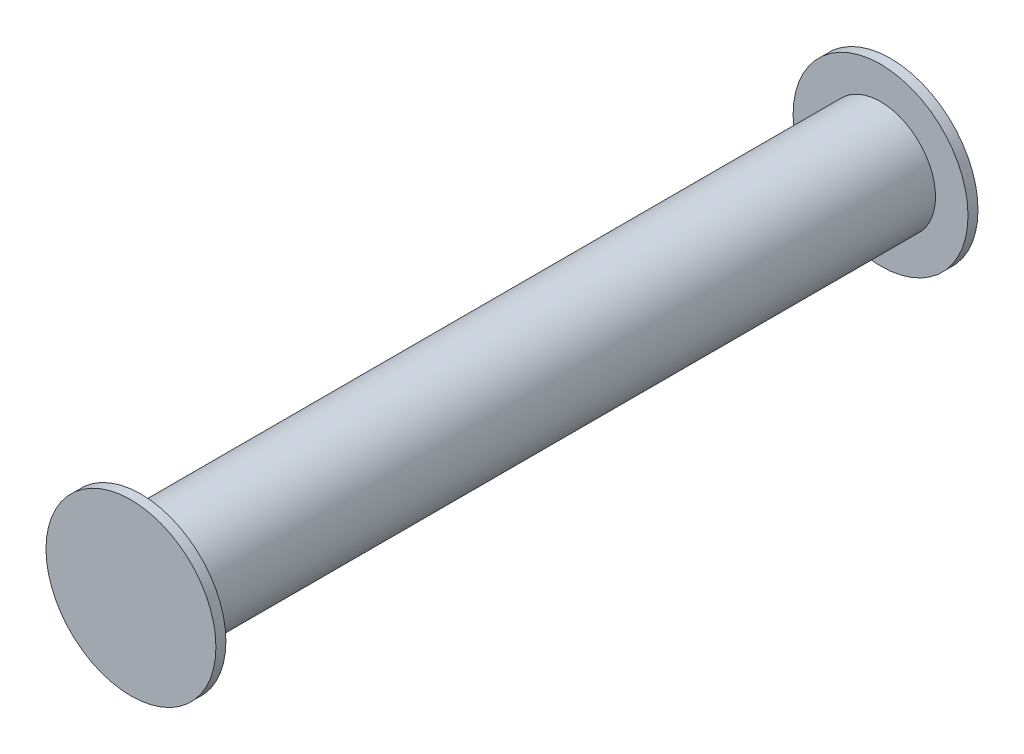
ISO-10303-21;
HEADER;
FILE_DESCRIPTION(('STEP AP214'),'2;1');
FILE_NAME('part.step','',(''),(''),'','','');
FILE_SCHEMA(('AUTOMOTIVE_DESIGN { 1 0 10303 214 1 1 1 1 }'));
ENDSEC;
DATA;
#1=APPLICATION_CONTEXT('core data for automotive mechanical design processes');
#2=APPLICATION_PROTOCOL_DEFINITION('international standard','automotive_design',2000,#1);
#3=PRODUCT_CONTEXT('',#1,'mechanical');
#4=PRODUCT('Part','Part','',(#3));
#5=PRODUCT_RELATED_PRODUCT_CATEGORY('part','',(#4));
#6=PRODUCT_DEFINITION_FORMATION('','',#4);
#7=PRODUCT_DEFINITION_CONTEXT('part definition',#1,'design');
#8=PRODUCT_DEFINITION('design','',#6,#7);
#9=PRODUCT_DEFINITION_SHAPE('','',#8);
#10=(LENGTH_UNIT() NAMED_UNIT(*) SI_UNIT(.MILLI.,.METRE.));
#11=(NAMED_UNIT(*) PLANE_ANGLE_UNIT() SI_UNIT($,.RADIAN.));
#12=(NAMED_UNIT(*) SI_UNIT($,.STERADIAN.) SOLID_ANGLE_UNIT());
#13=UNCERTAINTY_MEASURE_WITH_UNIT(LENGTH_MEASURE(1.E-05),#10,'distance_accuracy_value','');
#14=(GEOMETRIC_REPRESENTATION_CONTEXT(3) GLOBAL_UNCERTAINTY_ASSIGNED_CONTEXT((#13)) GLOBAL_UNIT_ASSIGNED_CONTEXT((#10,
#11,#12)) REPRESENTATION_CONTEXT('',''));
#15=CARTESIAN_POINT('',(0.,0.,0.));
#16=DIRECTION('',(0.,0.,1.));
#17=DIRECTION('',(1.,0.,0.));
#18=AXIS2_PLACEMENT_3D('',#15,#16,#17);
#19=CARTESIAN_POINT('',(0.,0.,152.));
#20=DIRECTION('',(0.,0.,-1.));
#21=DIRECTION('',(-1.,0.,0.));
#22=AXIS2_PLACEMENT_3D('',#19,#20,#21);
#23=CYLINDRICAL_SURFACE('',#22,11.);
#24=CARTESIAN_POINT('',(0.,0.,2.));
#25=DIRECTION('',(0.,0.,1.));
#26=DIRECTION('',(1.,0.,0.));
#27=AXIS2_PLACEMENT_3D('',#24,#25,#26);
#28=CIRCLE('',#27,11.);
#29=CARTESIAN_POINT('',(11.,0.,2.));
#30=VERTEX_POINT('',#29);
#31=EDGE_CURVE('E48',#30,#30,#28,.T.);
#32=ORIENTED_EDGE('',*,*,#31,.T.);
#33=EDGE_LOOP('',(#32));
#34=FACE_BOUND('',#33,.T.);
#35=CARTESIAN_POINT('',(0.,0.,150.));
#36=DIRECTION('',(0.,0.,1.));
#37=DIRECTION('',(1.,0.,0.));
#38=AXIS2_PLACEMENT_3D('',#35,#36,#37);
#39=CIRCLE('',#38,11.);
#40=CARTESIAN_POINT('',(11.,0.,150.));
#41=VERTEX_POINT('',#40);
#42=EDGE_CURVE('E10',#41,#41,#39,.T.);
#43=ORIENTED_EDGE('',*,*,#42,.F.);
#44=EDGE_LOOP('',(#43));
#45=FACE_BOUND('',#44,.T.);
#46=ADVANCED_FACE('F32',(#34,#45),#23,.T.);
#47=CARTESIAN_POINT('',(0.,0.,2.));
#48=DIRECTION('',(0.,0.,-1.));
#49=DIRECTION('',(-1.,0.,0.));
#50=AXIS2_PLACEMENT_3D('',#47,#48,#49);
#51=CYLINDRICAL_SURFACE('',#50,17.5);
#52=CARTESIAN_POINT('',(0.,0.,2.));
#53=DIRECTION('',(0.,0.,1.));
#54=DIRECTION('',(1.,0.,0.));
#55=AXIS2_PLACEMENT_3D('',#52,#53,#54);
#56=CIRCLE('',#55,17.5);
#57=CARTESIAN_POINT('',(17.5,0.,2.));
#58=VERTEX_POINT('',#57);
#59=EDGE_CURVE('E39',#58,#58,#56,.T.);
#60=ORIENTED_EDGE('',*,*,#59,.F.);
#61=EDGE_LOOP('',(#60));
#62=FACE_BOUND('',#61,.T.);
#63=CARTESIAN_POINT('',(0.,0.,0.));
#64=DIRECTION('',(0.,0.,1.));
#65=DIRECTION('',(1.,0.,0.));
#66=AXIS2_PLACEMENT_3D('',#63,#64,#65);
#67=CIRCLE('',#66,17.5);
#68=CARTESIAN_POINT('',(17.5,0.,0.));
#69=VERTEX_POINT('',#68);
#70=EDGE_CURVE('E43',#69,#69,#67,.T.);
#71=ORIENTED_EDGE('',*,*,#70,.T.);
#72=EDGE_LOOP('',(#71));
#73=FACE_BOUND('',#72,.T.);
#74=ADVANCED_FACE('F34',(#62,#73),#51,.T.);
#75=CARTESIAN_POINT('',(0.,0.,2.));
#76=DIRECTION('',(0.,0.,1.));
#77=DIRECTION('',(1.,0.,0.));
#78=AXIS2_PLACEMENT_3D('',#75,#76,#77);
#79=PLANE('',#78);
#80=ORIENTED_EDGE('',*,*,#31,.F.);
#81=EDGE_LOOP('',(#80));
#82=FACE_BOUND('',#81,.T.);
#83=ORIENTED_EDGE('',*,*,#59,.T.);
#84=EDGE_LOOP('',(#83));
#85=FACE_BOUND('',#84,.T.);
#86=ADVANCED_FACE('F77',(#82,#85),#79,.T.);
#87=CARTESIAN_POINT('',(0.,0.,0.));
#88=DIRECTION('',(0.,0.,1.));
#89=DIRECTION('',(1.,0.,0.));
#90=AXIS2_PLACEMENT_3D('',#87,#88,#89);
#91=PLANE('',#90);
#92=ORIENTED_EDGE('',*,*,#70,.F.);
#93=EDGE_LOOP('',(#92));
#94=FACE_BOUND('',#93,.T.);
#95=ADVANCED_FACE('F82',(#94),#91,.F.);
#96=CARTESIAN_POINT('',(11.,0.,150.));
#97=DIRECTION('',(0.,0.,1.));
#98=DIRECTION('',(1.,0.,0.));
#99=AXIS2_PLACEMENT_3D('',#96,#97,#98);
#100=PLANE('',#99);
#101=ORIENTED_EDGE('',*,*,#42,.T.);
#102=EDGE_LOOP('',(#101));
#103=FACE_BOUND('',#102,.T.);
#104=CARTESIAN_POINT('',(0.,0.,150.));
#105=DIRECTION('',(0.,0.,-1.));
#106=DIRECTION('',(-1.,0.,0.));
#107=AXIS2_PLACEMENT_3D('',#104,#105,#106);
#108=CIRCLE('',#107,17.);
#109=CARTESIAN_POINT('',(-17.,0.,150.));
#110=VERTEX_POINT('',#109);
#111=EDGE_CURVE('E52',#110,#110,#108,.T.);
#112=ORIENTED_EDGE('',*,*,#111,.T.);
#113=EDGE_LOOP('',(#112));
#114=FACE_BOUND('',#113,.T.);
#115=ADVANCED_FACE('F67',(#103,#114),#100,.F.);
#116=CARTESIAN_POINT('',(0.,0.,137.22015424657));
#117=DIRECTION('',(0.,0.,-1.));
#118=DIRECTION('',(-1.,0.,0.));
#119=AXIS2_PLACEMENT_3D('',#116,#117,#118);
#120=CYLINDRICAL_SURFACE('',#119,17.);
#121=ORIENTED_EDGE('',*,*,#111,.F.);
#122=EDGE_LOOP('',(#121));
#123=FACE_BOUND('',#122,.T.);
#124=CARTESIAN_POINT('',(0.,0.,152.));
#125=DIRECTION('',(0.,0.,-1.));
#126=DIRECTION('',(-1.,0.,0.));
#127=AXIS2_PLACEMENT_3D('',#124,#125,#126);
#128=CIRCLE('',#127,17.);
#129=CARTESIAN_POINT('',(-17.,0.,152.));
#130=VERTEX_POINT('',#129);
#131=EDGE_CURVE('E55',#130,#130,#128,.T.);
#132=ORIENTED_EDGE('',*,*,#131,.T.);
#133=EDGE_LOOP('',(#132));
#134=FACE_BOUND('',#133,.T.);
#135=ADVANCED_FACE('F59',(#123,#134),#120,.T.);
#136=CARTESIAN_POINT('',(0.,0.,152.));
#137=DIRECTION('',(0.,0.,1.));
#138=DIRECTION('',(1.,0.,0.));
#139=AXIS2_PLACEMENT_3D('',#136,#137,#138);
#140=PLANE('',#139);
#141=ORIENTED_EDGE('',*,*,#131,.F.);
#142=EDGE_LOOP('',(#141));
#143=FACE_BOUND('',#142,.T.);
#144=ADVANCED_FACE('F61',(#143),#140,.T.);
#145=CLOSED_SHELL('',(#46,#74,#86,#95,#115,#135,#144));
#146=MANIFOLD_SOLID_BREP('B2',#145);
#147=ADVANCED_BREP_SHAPE_REPRESENTATION('',(#18,#146),#14);
#148=SHAPE_DEFINITION_REPRESENTATION(#9,#147);
ENDSEC;
END-ISO-10303-21;
